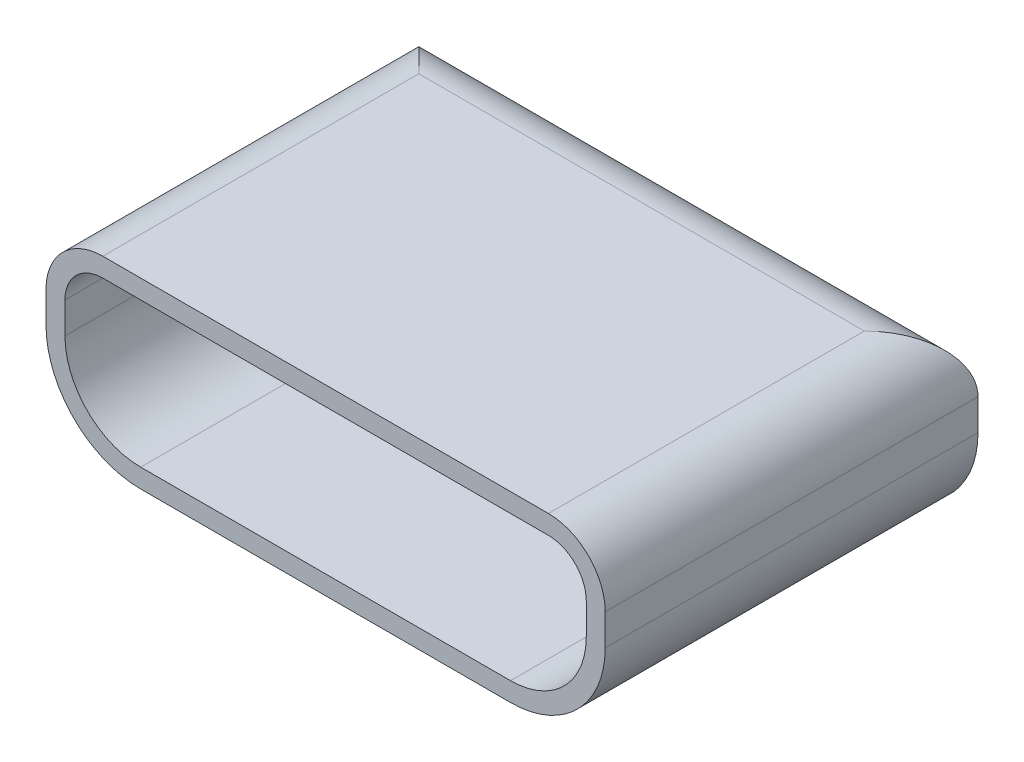
ISO-10303-21;
HEADER;
FILE_DESCRIPTION(('STEP AP214'),'2;1');
FILE_NAME('part.step','',(''),(''),'','','');
FILE_SCHEMA(('AUTOMOTIVE_DESIGN { 1 0 10303 214 1 1 1 1 }'));
ENDSEC;
DATA;
#1=APPLICATION_CONTEXT('core data for automotive mechanical design processes');
#2=APPLICATION_PROTOCOL_DEFINITION('international standard','automotive_design',2000,#1);
#3=PRODUCT_CONTEXT('',#1,'mechanical');
#4=PRODUCT('Part','Part','',(#3));
#5=PRODUCT_RELATED_PRODUCT_CATEGORY('part','',(#4));
#6=PRODUCT_DEFINITION_FORMATION('','',#4);
#7=PRODUCT_DEFINITION_CONTEXT('part definition',#1,'design');
#8=PRODUCT_DEFINITION('design','',#6,#7);
#9=PRODUCT_DEFINITION_SHAPE('','',#8);
#10=(LENGTH_UNIT() NAMED_UNIT(*) SI_UNIT(.MILLI.,.METRE.));
#11=(NAMED_UNIT(*) PLANE_ANGLE_UNIT() SI_UNIT($,.RADIAN.));
#12=(NAMED_UNIT(*) SI_UNIT($,.STERADIAN.) SOLID_ANGLE_UNIT());
#13=UNCERTAINTY_MEASURE_WITH_UNIT(LENGTH_MEASURE(1.E-05),#10,'distance_accuracy_value','');
#14=(GEOMETRIC_REPRESENTATION_CONTEXT(3) GLOBAL_UNCERTAINTY_ASSIGNED_CONTEXT((#13)) GLOBAL_UNIT_ASSIGNED_CONTEXT((#10,
#11,#12)) REPRESENTATION_CONTEXT('',''));
#15=CARTESIAN_POINT('',(0.,0.,0.));
#16=DIRECTION('',(0.,0.,1.));
#17=DIRECTION('',(1.,0.,0.));
#18=AXIS2_PLACEMENT_3D('',#15,#16,#17);
#19=CARTESIAN_POINT('',(-3.75,-1.225,5.));
#20=DIRECTION('',(1.,0.,0.));
#21=DIRECTION('',(0.,0.,-1.));
#22=AXIS2_PLACEMENT_3D('',#19,#20,#21);
#23=PLANE('',#22);
#24=DIRECTION('',(0.,-1.,0.));
#25=VECTOR('',#24,1.);
#26=CARTESIAN_POINT('',(-3.75,-1.225,0.));
#27=LINE('',#26,#25);
#28=CARTESIAN_POINT('',(-3.75,0.462999999999999,0.));
#29=VERTEX_POINT('',#28);
#30=CARTESIAN_POINT('',(-3.75,0.0449999999999995,0.));
#31=VERTEX_POINT('',#30);
#32=EDGE_CURVE('E230',#29,#31,#27,.T.);
#33=ORIENTED_EDGE('',*,*,#32,.T.);
#34=DIRECTION('',(0.,0.,-1.));
#35=VECTOR('',#34,1.);
#36=CARTESIAN_POINT('',(-3.75,0.0449999999999995,5.));
#37=LINE('',#36,#35);
#38=CARTESIAN_POINT('',(-3.75,0.0449999999999995,5.));
#39=VERTEX_POINT('',#38);
#40=EDGE_CURVE('E268',#31,#39,#37,.F.);
#41=ORIENTED_EDGE('',*,*,#40,.T.);
#42=DIRECTION('',(0.,-1.,0.));
#43=VECTOR('',#42,1.);
#44=CARTESIAN_POINT('',(-3.75,-1.225,5.));
#45=LINE('',#44,#43);
#46=CARTESIAN_POINT('',(-3.75,0.462999999999999,5.));
#47=VERTEX_POINT('',#46);
#48=EDGE_CURVE('E218',#47,#39,#45,.T.);
#49=ORIENTED_EDGE('',*,*,#48,.F.);
#50=DIRECTION('',(0.,0.,-1.));
#51=VECTOR('',#50,1.);
#52=CARTESIAN_POINT('',(-3.75,0.462999999999999,5.));
#53=LINE('',#52,#51);
#54=EDGE_CURVE('E229',#47,#29,#53,.T.);
#55=ORIENTED_EDGE('',*,*,#54,.T.);
#56=EDGE_LOOP('',(#33,#41,#49,#55));
#57=FACE_BOUND('',#56,.T.);
#58=ADVANCED_FACE('F33',(#57),#23,.F.);
#59=CARTESIAN_POINT('',(3.75,-1.225,5.));
#60=DIRECTION('',(0.,1.,0.));
#61=DIRECTION('',(-1.,0.,0.));
#62=AXIS2_PLACEMENT_3D('',#59,#60,#61);
#63=PLANE('',#62);
#64=DIRECTION('',(1.,0.,0.));
#65=VECTOR('',#64,1.);
#66=CARTESIAN_POINT('',(3.75,-1.225,5.));
#67=LINE('',#66,#65);
#68=CARTESIAN_POINT('',(-2.48,-1.225,5.));
#69=VERTEX_POINT('',#68);
#70=CARTESIAN_POINT('',(2.48,-1.225,5.));
#71=VERTEX_POINT('',#70);
#72=EDGE_CURVE('E221',#69,#71,#67,.T.);
#73=ORIENTED_EDGE('',*,*,#72,.F.);
#74=DIRECTION('',(0.,0.,-1.));
#75=VECTOR('',#74,1.);
#76=CARTESIAN_POINT('',(-2.48,-1.225,5.));
#77=LINE('',#76,#75);
#78=CARTESIAN_POINT('',(-2.48,-1.225,0.));
#79=VERTEX_POINT('',#78);
#80=EDGE_CURVE('E261',#69,#79,#77,.T.);
#81=ORIENTED_EDGE('',*,*,#80,.T.);
#82=DIRECTION('',(1.,0.,0.));
#83=VECTOR('',#82,1.);
#84=CARTESIAN_POINT('',(3.75,-1.225,0.));
#85=LINE('',#84,#83);
#86=CARTESIAN_POINT('',(2.48,-1.225,0.));
#87=VERTEX_POINT('',#86);
#88=EDGE_CURVE('E233',#79,#87,#85,.T.);
#89=ORIENTED_EDGE('',*,*,#88,.T.);
#90=DIRECTION('',(0.,0.,-1.));
#91=VECTOR('',#90,1.);
#92=CARTESIAN_POINT('',(2.48,-1.225,5.));
#93=LINE('',#92,#91);
#94=EDGE_CURVE('E256',#87,#71,#93,.F.);
#95=ORIENTED_EDGE('',*,*,#94,.T.);
#96=EDGE_LOOP('',(#73,#81,#89,#95));
#97=FACE_BOUND('',#96,.T.);
#98=ADVANCED_FACE('F278',(#97),#63,.F.);
#99=CARTESIAN_POINT('',(3.75,-1.225,5.));
#100=DIRECTION('',(-1.,0.,0.));
#101=DIRECTION('',(0.,0.,1.));
#102=AXIS2_PLACEMENT_3D('',#99,#100,#101);
#103=PLANE('',#102);
#104=DIRECTION('',(0.,1.,0.));
#105=VECTOR('',#104,1.);
#106=CARTESIAN_POINT('',(3.75,-1.225,5.));
#107=LINE('',#106,#105);
#108=CARTESIAN_POINT('',(3.75,0.0450000000000001,5.));
#109=VERTEX_POINT('',#108);
#110=CARTESIAN_POINT('',(3.75,0.463,5.));
#111=VERTEX_POINT('',#110);
#112=EDGE_CURVE('E224',#109,#111,#107,.T.);
#113=ORIENTED_EDGE('',*,*,#112,.F.);
#114=DIRECTION('',(0.,0.,-1.));
#115=VECTOR('',#114,1.);
#116=CARTESIAN_POINT('',(3.75,0.0450000000000001,5.));
#117=LINE('',#116,#115);
#118=CARTESIAN_POINT('',(3.75,0.0450000000000001,0.));
#119=VERTEX_POINT('',#118);
#120=EDGE_CURVE('E11',#109,#119,#117,.T.);
#121=ORIENTED_EDGE('',*,*,#120,.T.);
#122=DIRECTION('',(0.,1.,0.));
#123=VECTOR('',#122,1.);
#124=CARTESIAN_POINT('',(3.75,-1.225,0.));
#125=LINE('',#124,#123);
#126=CARTESIAN_POINT('',(3.75,0.463,0.));
#127=VERTEX_POINT('',#126);
#128=EDGE_CURVE('E222',#119,#127,#125,.T.);
#129=ORIENTED_EDGE('',*,*,#128,.T.);
#130=DIRECTION('',(0.,0.,-1.));
#131=VECTOR('',#130,1.);
#132=CARTESIAN_POINT('',(3.75,0.463,5.));
#133=LINE('',#132,#131);
#134=EDGE_CURVE('E253',#127,#111,#133,.F.);
#135=ORIENTED_EDGE('',*,*,#134,.T.);
#136=EDGE_LOOP('',(#113,#121,#129,#135));
#137=FACE_BOUND('',#136,.T.);
#138=ADVANCED_FACE('F304',(#137),#103,.F.);
#139=CARTESIAN_POINT('',(3.75,1.225,5.));
#140=DIRECTION('',(0.,-1.,0.));
#141=DIRECTION('',(1.,0.,0.));
#142=AXIS2_PLACEMENT_3D('',#139,#140,#141);
#143=PLANE('',#142);
#144=DIRECTION('',(-1.,0.,0.));
#145=VECTOR('',#144,1.);
#146=CARTESIAN_POINT('',(3.75,1.225,0.762));
#147=LINE('',#146,#145);
#148=CARTESIAN_POINT('',(2.988,1.225,0.762));
#149=VERTEX_POINT('',#148);
#150=CARTESIAN_POINT('',(-2.988,1.225,0.762));
#151=VERTEX_POINT('',#150);
#152=EDGE_CURVE('E242',#149,#151,#147,.T.);
#153=ORIENTED_EDGE('',*,*,#152,.T.);
#154=DIRECTION('',(0.,0.,-1.));
#155=VECTOR('',#154,1.);
#156=CARTESIAN_POINT('',(-2.988,1.225,5.));
#157=LINE('',#156,#155);
#158=CARTESIAN_POINT('',(-2.988,1.225,5.));
#159=VERTEX_POINT('',#158);
#160=EDGE_CURVE('E244',#151,#159,#157,.F.);
#161=ORIENTED_EDGE('',*,*,#160,.T.);
#162=DIRECTION('',(-1.,0.,0.));
#163=VECTOR('',#162,1.);
#164=CARTESIAN_POINT('',(3.75,1.225,5.));
#165=LINE('',#164,#163);
#166=CARTESIAN_POINT('',(2.988,1.225,5.));
#167=VERTEX_POINT('',#166);
#168=EDGE_CURVE('E226',#167,#159,#165,.T.);
#169=ORIENTED_EDGE('',*,*,#168,.F.);
#170=DIRECTION('',(0.,0.,-1.));
#171=VECTOR('',#170,1.);
#172=CARTESIAN_POINT('',(2.988,1.225,5.));
#173=LINE('',#172,#171);
#174=EDGE_CURVE('E240',#167,#149,#173,.T.);
#175=ORIENTED_EDGE('',*,*,#174,.T.);
#176=EDGE_LOOP('',(#153,#161,#169,#175));
#177=FACE_BOUND('',#176,.T.);
#178=ADVANCED_FACE('F334',(#177),#143,.F.);
#179=CARTESIAN_POINT('',(0.,0.,5.));
#180=DIRECTION('',(0.,0.,1.));
#181=DIRECTION('',(1.,0.,0.));
#182=AXIS2_PLACEMENT_3D('',#179,#180,#181);
#183=PLANE('',#182);
#184=CARTESIAN_POINT('',(2.988,0.463,5.));
#185=DIRECTION('',(0.,0.,1.));
#186=DIRECTION('',(1.,0.,0.));
#187=AXIS2_PLACEMENT_3D('',#184,#185,#186);
#188=CIRCLE('',#187,0.508);
#189=CARTESIAN_POINT('',(3.496,0.463,5.));
#190=VERTEX_POINT('',#189);
#191=CARTESIAN_POINT('',(2.988,0.971,5.));
#192=VERTEX_POINT('',#191);
#193=EDGE_CURVE('E48',#190,#192,#188,.T.);
#194=ORIENTED_EDGE('',*,*,#193,.F.);
#195=DIRECTION('',(0.,1.,0.));
#196=VECTOR('',#195,1.);
#197=CARTESIAN_POINT('',(3.496,0.0450000000000002,5.));
#198=LINE('',#197,#196);
#199=CARTESIAN_POINT('',(3.496,0.0450000000000002,5.));
#200=VERTEX_POINT('',#199);
#201=EDGE_CURVE('E168',#200,#190,#198,.T.);
#202=ORIENTED_EDGE('',*,*,#201,.F.);
#203=CARTESIAN_POINT('',(2.48,0.0450000000000001,5.));
#204=DIRECTION('',(0.,0.,1.));
#205=DIRECTION('',(1.,0.,0.));
#206=AXIS2_PLACEMENT_3D('',#203,#204,#205);
#207=CIRCLE('',#206,1.016);
#208=CARTESIAN_POINT('',(2.48,-0.971,5.));
#209=VERTEX_POINT('',#208);
#210=EDGE_CURVE('E171',#209,#200,#207,.T.);
#211=ORIENTED_EDGE('',*,*,#210,.F.);
#212=DIRECTION('',(1.,0.,0.));
#213=VECTOR('',#212,1.);
#214=CARTESIAN_POINT('',(-2.48,-0.971000000000001,5.));
#215=LINE('',#214,#213);
#216=CARTESIAN_POINT('',(-2.48,-0.971000000000001,5.));
#217=VERTEX_POINT('',#216);
#218=EDGE_CURVE('E199',#217,#209,#215,.T.);
#219=ORIENTED_EDGE('',*,*,#218,.F.);
#220=CARTESIAN_POINT('',(-2.48,0.0449999999999994,5.));
#221=DIRECTION('',(0.,0.,1.));
#222=DIRECTION('',(1.,0.,0.));
#223=AXIS2_PLACEMENT_3D('',#220,#221,#222);
#224=CIRCLE('',#223,1.016);
#225=CARTESIAN_POINT('',(-3.496,0.0449999999999996,5.));
#226=VERTEX_POINT('',#225);
#227=EDGE_CURVE('E196',#226,#217,#224,.T.);
#228=ORIENTED_EDGE('',*,*,#227,.F.);
#229=DIRECTION('',(0.,-1.,0.));
#230=VECTOR('',#229,1.);
#231=CARTESIAN_POINT('',(-3.496,0.462999999999999,5.));
#232=LINE('',#231,#230);
#233=CARTESIAN_POINT('',(-3.496,0.462999999999999,5.));
#234=VERTEX_POINT('',#233);
#235=EDGE_CURVE('E193',#234,#226,#232,.T.);
#236=ORIENTED_EDGE('',*,*,#235,.F.);
#237=CARTESIAN_POINT('',(-2.988,0.462999999999999,5.));
#238=DIRECTION('',(0.,0.,1.));
#239=DIRECTION('',(1.,0.,0.));
#240=AXIS2_PLACEMENT_3D('',#237,#238,#239);
#241=CIRCLE('',#240,0.508);
#242=CARTESIAN_POINT('',(-2.988,0.971,5.));
#243=VERTEX_POINT('',#242);
#244=EDGE_CURVE('E190',#243,#234,#241,.T.);
#245=ORIENTED_EDGE('',*,*,#244,.F.);
#246=DIRECTION('',(-1.,0.,0.));
#247=VECTOR('',#246,1.);
#248=CARTESIAN_POINT('',(2.988,0.971,5.));
#249=LINE('',#248,#247);
#250=EDGE_CURVE('E188',#192,#243,#249,.T.);
#251=ORIENTED_EDGE('',*,*,#250,.F.);
#252=EDGE_LOOP('',(#194,#202,#211,#219,#228,#236,#245,#251));
#253=FACE_BOUND('',#252,.T.);
#254=ORIENTED_EDGE('',*,*,#48,.T.);
#255=CARTESIAN_POINT('',(-2.48,0.0449999999999994,5.));
#256=DIRECTION('',(0.,0.,1.));
#257=DIRECTION('',(1.,0.,0.));
#258=AXIS2_PLACEMENT_3D('',#255,#256,#257);
#259=CIRCLE('',#258,1.27);
#260=EDGE_CURVE('E41',#39,#69,#259,.T.);
#261=ORIENTED_EDGE('',*,*,#260,.T.);
#262=ORIENTED_EDGE('',*,*,#72,.T.);
#263=CARTESIAN_POINT('',(2.48,0.0450000000000001,5.));
#264=DIRECTION('',(0.,0.,1.));
#265=DIRECTION('',(1.,0.,0.));
#266=AXIS2_PLACEMENT_3D('',#263,#264,#265);
#267=CIRCLE('',#266,1.27);
#268=EDGE_CURVE('E56',#71,#109,#267,.T.);
#269=ORIENTED_EDGE('',*,*,#268,.T.);
#270=ORIENTED_EDGE('',*,*,#112,.T.);
#271=CARTESIAN_POINT('',(2.988,0.463,5.));
#272=DIRECTION('',(0.,0.,1.));
#273=DIRECTION('',(1.,0.,0.));
#274=AXIS2_PLACEMENT_3D('',#271,#272,#273);
#275=CIRCLE('',#274,0.762);
#276=EDGE_CURVE('E246',#111,#167,#275,.T.);
#277=ORIENTED_EDGE('',*,*,#276,.T.);
#278=ORIENTED_EDGE('',*,*,#168,.T.);
#279=CARTESIAN_POINT('',(-2.988,0.462999999999999,5.));
#280=DIRECTION('',(0.,0.,1.));
#281=DIRECTION('',(1.,0.,0.));
#282=AXIS2_PLACEMENT_3D('',#279,#280,#281);
#283=CIRCLE('',#282,0.762);
#284=EDGE_CURVE('E248',#159,#47,#283,.T.);
#285=ORIENTED_EDGE('',*,*,#284,.T.);
#286=EDGE_LOOP('',(#254,#261,#262,#269,#270,#277,#278,#285));
#287=FACE_BOUND('',#286,.T.);
#288=ADVANCED_FACE('F272',(#253,#287),#183,.T.);
#289=CARTESIAN_POINT('',(0.,0.,0.));
#290=DIRECTION('',(0.,0.,1.));
#291=DIRECTION('',(1.,0.,0.));
#292=AXIS2_PLACEMENT_3D('',#289,#290,#291);
#293=PLANE('',#292);
#294=ORIENTED_EDGE('',*,*,#88,.F.);
#295=CARTESIAN_POINT('',(-2.48,0.0449999999999994,0.));
#296=DIRECTION('',(0.,0.,1.));
#297=DIRECTION('',(1.,0.,0.));
#298=AXIS2_PLACEMENT_3D('',#295,#296,#297);
#299=CIRCLE('',#298,1.27);
#300=EDGE_CURVE('E266',#79,#31,#299,.F.);
#301=ORIENTED_EDGE('',*,*,#300,.T.);
#302=ORIENTED_EDGE('',*,*,#32,.F.);
#303=DIRECTION('',(-1.,0.,0.));
#304=VECTOR('',#303,1.);
#305=CARTESIAN_POINT('',(0.,0.463,0.));
#306=LINE('',#305,#304);
#307=EDGE_CURVE('E250',#29,#127,#306,.F.);
#308=ORIENTED_EDGE('',*,*,#307,.T.);
#309=ORIENTED_EDGE('',*,*,#128,.F.);
#310=CARTESIAN_POINT('',(2.48,0.0450000000000001,0.));
#311=DIRECTION('',(0.,0.,1.));
#312=DIRECTION('',(1.,0.,0.));
#313=AXIS2_PLACEMENT_3D('',#310,#311,#312);
#314=CIRCLE('',#313,1.27);
#315=EDGE_CURVE('E264',#119,#87,#314,.F.);
#316=ORIENTED_EDGE('',*,*,#315,.T.);
#317=EDGE_LOOP('',(#294,#301,#302,#308,#309,#316));
#318=FACE_BOUND('',#317,.T.);
#319=ADVANCED_FACE('F284',(#318),#293,.F.);
#320=CARTESIAN_POINT('',(2.988,0.463,5.));
#321=DIRECTION('',(0.,0.,-1.));
#322=DIRECTION('',(-1.,0.,0.));
#323=AXIS2_PLACEMENT_3D('',#320,#321,#322);
#324=CYLINDRICAL_SURFACE('',#323,0.762);
#325=ORIENTED_EDGE('',*,*,#276,.F.);
#326=ORIENTED_EDGE('',*,*,#134,.F.);
#327=CARTESIAN_POINT('',(2.988,0.463,0.762));
#328=DIRECTION('',(-0.707106781186547,0.,-0.707106781186547));
#329=DIRECTION('',(0.707106781186547,0.,-0.707106781186547));
#330=AXIS2_PLACEMENT_3D('',#327,#328,#329);
#331=ELLIPSE('',#330,1.0776307345283,0.762);
#332=EDGE_CURVE('E234',#149,#127,#331,.T.);
#333=ORIENTED_EDGE('',*,*,#332,.F.);
#334=ORIENTED_EDGE('',*,*,#174,.F.);
#335=EDGE_LOOP('',(#325,#326,#333,#334));
#336=FACE_BOUND('',#335,.T.);
#337=ADVANCED_FACE('F301',(#336),#324,.T.);
#338=CARTESIAN_POINT('',(3.75,0.463,0.762));
#339=DIRECTION('',(-1.,0.,0.));
#340=DIRECTION('',(0.,-1.,0.));
#341=AXIS2_PLACEMENT_3D('',#338,#339,#340);
#342=CYLINDRICAL_SURFACE('',#341,0.762);
#343=ORIENTED_EDGE('',*,*,#332,.T.);
#344=ORIENTED_EDGE('',*,*,#307,.F.);
#345=CARTESIAN_POINT('',(-2.988,0.463,0.762));
#346=DIRECTION('',(-0.707106781186547,0.,0.707106781186547));
#347=DIRECTION('',(-0.707106781186547,0.,-0.707106781186547));
#348=AXIS2_PLACEMENT_3D('',#345,#346,#347);
#349=ELLIPSE('',#348,1.0776307345283,0.762);
#350=EDGE_CURVE('E206',#151,#29,#349,.T.);
#351=ORIENTED_EDGE('',*,*,#350,.F.);
#352=ORIENTED_EDGE('',*,*,#152,.F.);
#353=EDGE_LOOP('',(#343,#344,#351,#352));
#354=FACE_BOUND('',#353,.T.);
#355=ADVANCED_FACE('F295',(#354),#342,.T.);
#356=CARTESIAN_POINT('',(-2.988,0.462999999999999,5.));
#357=DIRECTION('',(0.,0.,-1.));
#358=DIRECTION('',(-1.,0.,0.));
#359=AXIS2_PLACEMENT_3D('',#356,#357,#358);
#360=CYLINDRICAL_SURFACE('',#359,0.762);
#361=ORIENTED_EDGE('',*,*,#284,.F.);
#362=ORIENTED_EDGE('',*,*,#160,.F.);
#363=ORIENTED_EDGE('',*,*,#350,.T.);
#364=ORIENTED_EDGE('',*,*,#54,.F.);
#365=EDGE_LOOP('',(#361,#362,#363,#364));
#366=FACE_BOUND('',#365,.T.);
#367=ADVANCED_FACE('F289',(#366),#360,.T.);
#368=CARTESIAN_POINT('',(-2.48,0.0449999999999994,5.));
#369=DIRECTION('',(0.,0.,-1.));
#370=DIRECTION('',(-1.,0.,0.));
#371=AXIS2_PLACEMENT_3D('',#368,#369,#370);
#372=CYLINDRICAL_SURFACE('',#371,1.27);
#373=ORIENTED_EDGE('',*,*,#260,.F.);
#374=ORIENTED_EDGE('',*,*,#40,.F.);
#375=ORIENTED_EDGE('',*,*,#300,.F.);
#376=ORIENTED_EDGE('',*,*,#80,.F.);
#377=EDGE_LOOP('',(#373,#374,#375,#376));
#378=FACE_BOUND('',#377,.T.);
#379=ADVANCED_FACE('F281',(#378),#372,.T.);
#380=CARTESIAN_POINT('',(2.48,0.0450000000000001,5.));
#381=DIRECTION('',(0.,0.,-1.));
#382=DIRECTION('',(-1.,0.,0.));
#383=AXIS2_PLACEMENT_3D('',#380,#381,#382);
#384=CYLINDRICAL_SURFACE('',#383,1.27);
#385=ORIENTED_EDGE('',*,*,#268,.F.);
#386=ORIENTED_EDGE('',*,*,#94,.F.);
#387=ORIENTED_EDGE('',*,*,#315,.F.);
#388=ORIENTED_EDGE('',*,*,#120,.F.);
#389=EDGE_LOOP('',(#385,#386,#387,#388));
#390=FACE_BOUND('',#389,.T.);
#391=ADVANCED_FACE('F35',(#390),#384,.T.);
#392=CARTESIAN_POINT('',(2.988,0.463,1.));
#393=DIRECTION('',(0.,0.,1.));
#394=DIRECTION('',(1.,0.,0.));
#395=AXIS2_PLACEMENT_3D('',#392,#393,#394);
#396=CYLINDRICAL_SURFACE('',#395,0.508);
#397=ORIENTED_EDGE('',*,*,#193,.T.);
#398=DIRECTION('',(0.,0.,1.));
#399=VECTOR('',#398,1.);
#400=CARTESIAN_POINT('',(2.988,0.971,1.));
#401=LINE('',#400,#399);
#402=CARTESIAN_POINT('',(2.988,0.971,1.));
#403=VERTEX_POINT('',#402);
#404=EDGE_CURVE('E145',#403,#192,#401,.T.);
#405=ORIENTED_EDGE('',*,*,#404,.F.);
#406=CARTESIAN_POINT('',(2.988,0.463,1.));
#407=DIRECTION('',(0.,0.,1.));
#408=DIRECTION('',(1.,0.,0.));
#409=AXIS2_PLACEMENT_3D('',#406,#407,#408);
#410=CIRCLE('',#409,0.508);
#411=CARTESIAN_POINT('',(3.496,0.463,1.));
#412=VERTEX_POINT('',#411);
#413=EDGE_CURVE('E149',#412,#403,#410,.T.);
#414=ORIENTED_EDGE('',*,*,#413,.F.);
#415=DIRECTION('',(0.,0.,1.));
#416=VECTOR('',#415,1.);
#417=CARTESIAN_POINT('',(3.496,0.463,1.));
#418=LINE('',#417,#416);
#419=EDGE_CURVE('E204',#412,#190,#418,.T.);
#420=ORIENTED_EDGE('',*,*,#419,.T.);
#421=EDGE_LOOP('',(#397,#405,#414,#420));
#422=FACE_BOUND('',#421,.T.);
#423=ADVANCED_FACE('F147',(#422),#396,.F.);
#424=CARTESIAN_POINT('',(3.496,0.0450000000000002,1.));
#425=DIRECTION('',(1.,0.,0.));
#426=DIRECTION('',(0.,0.,-1.));
#427=AXIS2_PLACEMENT_3D('',#424,#425,#426);
#428=PLANE('',#427);
#429=ORIENTED_EDGE('',*,*,#201,.T.);
#430=ORIENTED_EDGE('',*,*,#419,.F.);
#431=DIRECTION('',(0.,1.,0.));
#432=VECTOR('',#431,1.);
#433=CARTESIAN_POINT('',(3.496,0.0450000000000002,1.));
#434=LINE('',#433,#432);
#435=CARTESIAN_POINT('',(3.496,0.0450000000000002,1.));
#436=VERTEX_POINT('',#435);
#437=EDGE_CURVE('E155',#436,#412,#434,.T.);
#438=ORIENTED_EDGE('',*,*,#437,.F.);
#439=DIRECTION('',(0.,0.,1.));
#440=VECTOR('',#439,1.);
#441=CARTESIAN_POINT('',(3.496,0.0450000000000002,1.));
#442=LINE('',#441,#440);
#443=EDGE_CURVE('E207',#436,#200,#442,.T.);
#444=ORIENTED_EDGE('',*,*,#443,.T.);
#445=EDGE_LOOP('',(#429,#430,#438,#444));
#446=FACE_BOUND('',#445,.T.);
#447=ADVANCED_FACE('F312',(#446),#428,.F.);
#448=CARTESIAN_POINT('',(2.48,0.0450000000000001,1.));
#449=DIRECTION('',(0.,0.,1.));
#450=DIRECTION('',(1.,0.,0.));
#451=AXIS2_PLACEMENT_3D('',#448,#449,#450);
#452=CYLINDRICAL_SURFACE('',#451,1.016);
#453=ORIENTED_EDGE('',*,*,#210,.T.);
#454=ORIENTED_EDGE('',*,*,#443,.F.);
#455=CARTESIAN_POINT('',(2.48,0.0450000000000001,1.));
#456=DIRECTION('',(0.,0.,1.));
#457=DIRECTION('',(1.,0.,0.));
#458=AXIS2_PLACEMENT_3D('',#455,#456,#457);
#459=CIRCLE('',#458,1.016);
#460=CARTESIAN_POINT('',(2.48,-0.971,1.));
#461=VERTEX_POINT('',#460);
#462=EDGE_CURVE('E184',#461,#436,#459,.T.);
#463=ORIENTED_EDGE('',*,*,#462,.F.);
#464=DIRECTION('',(0.,0.,1.));
#465=VECTOR('',#464,1.);
#466=CARTESIAN_POINT('',(2.48,-0.971,1.));
#467=LINE('',#466,#465);
#468=EDGE_CURVE('E209',#461,#209,#467,.T.);
#469=ORIENTED_EDGE('',*,*,#468,.T.);
#470=EDGE_LOOP('',(#453,#454,#463,#469));
#471=FACE_BOUND('',#470,.T.);
#472=ADVANCED_FACE('F372',(#471),#452,.F.);
#473=CARTESIAN_POINT('',(-2.48,-0.971000000000001,1.));
#474=DIRECTION('',(0.,-1.,0.));
#475=DIRECTION('',(1.,0.,0.));
#476=AXIS2_PLACEMENT_3D('',#473,#474,#475);
#477=PLANE('',#476);
#478=ORIENTED_EDGE('',*,*,#218,.T.);
#479=ORIENTED_EDGE('',*,*,#468,.F.);
#480=DIRECTION('',(1.,0.,0.));
#481=VECTOR('',#480,1.);
#482=CARTESIAN_POINT('',(-2.48,-0.971000000000001,1.));
#483=LINE('',#482,#481);
#484=CARTESIAN_POINT('',(-2.48,-0.971000000000001,1.));
#485=VERTEX_POINT('',#484);
#486=EDGE_CURVE('E181',#485,#461,#483,.T.);
#487=ORIENTED_EDGE('',*,*,#486,.F.);
#488=DIRECTION('',(0.,0.,1.));
#489=VECTOR('',#488,1.);
#490=CARTESIAN_POINT('',(-2.48,-0.971000000000001,1.));
#491=LINE('',#490,#489);
#492=EDGE_CURVE('E211',#485,#217,#491,.T.);
#493=ORIENTED_EDGE('',*,*,#492,.T.);
#494=EDGE_LOOP('',(#478,#479,#487,#493));
#495=FACE_BOUND('',#494,.T.);
#496=ADVANCED_FACE('F382',(#495),#477,.F.);
#497=CARTESIAN_POINT('',(-2.48,0.0449999999999994,1.));
#498=DIRECTION('',(0.,0.,1.));
#499=DIRECTION('',(1.,0.,0.));
#500=AXIS2_PLACEMENT_3D('',#497,#498,#499);
#501=CYLINDRICAL_SURFACE('',#500,1.016);
#502=ORIENTED_EDGE('',*,*,#227,.T.);
#503=ORIENTED_EDGE('',*,*,#492,.F.);
#504=CARTESIAN_POINT('',(-2.48,0.0449999999999994,1.));
#505=DIRECTION('',(0.,0.,1.));
#506=DIRECTION('',(1.,0.,0.));
#507=AXIS2_PLACEMENT_3D('',#504,#505,#506);
#508=CIRCLE('',#507,1.016);
#509=CARTESIAN_POINT('',(-3.496,0.0449999999999996,1.));
#510=VERTEX_POINT('',#509);
#511=EDGE_CURVE('E178',#510,#485,#508,.T.);
#512=ORIENTED_EDGE('',*,*,#511,.F.);
#513=DIRECTION('',(0.,0.,1.));
#514=VECTOR('',#513,1.);
#515=CARTESIAN_POINT('',(-3.496,0.0449999999999996,1.));
#516=LINE('',#515,#514);
#517=EDGE_CURVE('E213',#510,#226,#516,.T.);
#518=ORIENTED_EDGE('',*,*,#517,.T.);
#519=EDGE_LOOP('',(#502,#503,#512,#518));
#520=FACE_BOUND('',#519,.T.);
#521=ADVANCED_FACE('F392',(#520),#501,.F.);
#522=CARTESIAN_POINT('',(-3.496,0.462999999999999,1.));
#523=DIRECTION('',(-1.,0.,0.));
#524=DIRECTION('',(0.,0.,1.));
#525=AXIS2_PLACEMENT_3D('',#522,#523,#524);
#526=PLANE('',#525);
#527=ORIENTED_EDGE('',*,*,#235,.T.);
#528=ORIENTED_EDGE('',*,*,#517,.F.);
#529=DIRECTION('',(0.,-1.,0.));
#530=VECTOR('',#529,1.);
#531=CARTESIAN_POINT('',(-3.496,0.462999999999999,1.));
#532=LINE('',#531,#530);
#533=CARTESIAN_POINT('',(-3.496,0.462999999999999,1.));
#534=VERTEX_POINT('',#533);
#535=EDGE_CURVE('E175',#534,#510,#532,.T.);
#536=ORIENTED_EDGE('',*,*,#535,.F.);
#537=DIRECTION('',(0.,0.,1.));
#538=VECTOR('',#537,1.);
#539=CARTESIAN_POINT('',(-3.496,0.462999999999999,1.));
#540=LINE('',#539,#538);
#541=EDGE_CURVE('E215',#534,#234,#540,.T.);
#542=ORIENTED_EDGE('',*,*,#541,.T.);
#543=EDGE_LOOP('',(#527,#528,#536,#542));
#544=FACE_BOUND('',#543,.T.);
#545=ADVANCED_FACE('F402',(#544),#526,.F.);
#546=CARTESIAN_POINT('',(-2.988,0.462999999999999,1.));
#547=DIRECTION('',(0.,0.,1.));
#548=DIRECTION('',(1.,0.,0.));
#549=AXIS2_PLACEMENT_3D('',#546,#547,#548);
#550=CYLINDRICAL_SURFACE('',#549,0.508);
#551=ORIENTED_EDGE('',*,*,#244,.T.);
#552=ORIENTED_EDGE('',*,*,#541,.F.);
#553=CARTESIAN_POINT('',(-2.988,0.462999999999999,1.));
#554=DIRECTION('',(0.,0.,1.));
#555=DIRECTION('',(1.,0.,0.));
#556=AXIS2_PLACEMENT_3D('',#553,#554,#555);
#557=CIRCLE('',#556,0.508);
#558=CARTESIAN_POINT('',(-2.988,0.971,1.));
#559=VERTEX_POINT('',#558);
#560=EDGE_CURVE('E163',#559,#534,#557,.T.);
#561=ORIENTED_EDGE('',*,*,#560,.F.);
#562=DIRECTION('',(0.,0.,1.));
#563=VECTOR('',#562,1.);
#564=CARTESIAN_POINT('',(-2.988,0.971,1.));
#565=LINE('',#564,#563);
#566=EDGE_CURVE('E154',#559,#243,#565,.T.);
#567=ORIENTED_EDGE('',*,*,#566,.T.);
#568=EDGE_LOOP('',(#551,#552,#561,#567));
#569=FACE_BOUND('',#568,.T.);
#570=ADVANCED_FACE('F412',(#569),#550,.F.);
#571=CARTESIAN_POINT('',(2.988,0.971,1.));
#572=DIRECTION('',(0.,1.,0.));
#573=DIRECTION('',(-1.,0.,0.));
#574=AXIS2_PLACEMENT_3D('',#571,#572,#573);
#575=PLANE('',#574);
#576=ORIENTED_EDGE('',*,*,#250,.T.);
#577=ORIENTED_EDGE('',*,*,#566,.F.);
#578=DIRECTION('',(-1.,0.,0.));
#579=VECTOR('',#578,1.);
#580=CARTESIAN_POINT('',(2.988,0.971,1.));
#581=LINE('',#580,#579);
#582=EDGE_CURVE('E158',#403,#559,#581,.T.);
#583=ORIENTED_EDGE('',*,*,#582,.F.);
#584=ORIENTED_EDGE('',*,*,#404,.T.);
#585=EDGE_LOOP('',(#576,#577,#583,#584));
#586=FACE_BOUND('',#585,.T.);
#587=ADVANCED_FACE('F159',(#586),#575,.F.);
#588=CARTESIAN_POINT('',(2.988,0.463,1.));
#589=DIRECTION('',(0.,0.,1.));
#590=DIRECTION('',(1.,0.,0.));
#591=AXIS2_PLACEMENT_3D('',#588,#589,#590);
#592=PLANE('',#591);
#593=ORIENTED_EDGE('',*,*,#413,.T.);
#594=ORIENTED_EDGE('',*,*,#582,.T.);
#595=ORIENTED_EDGE('',*,*,#560,.T.);
#596=ORIENTED_EDGE('',*,*,#535,.T.);
#597=ORIENTED_EDGE('',*,*,#511,.T.);
#598=ORIENTED_EDGE('',*,*,#486,.T.);
#599=ORIENTED_EDGE('',*,*,#462,.T.);
#600=ORIENTED_EDGE('',*,*,#437,.T.);
#601=EDGE_LOOP('',(#593,#594,#595,#596,#597,#598,#599,#600));
#602=FACE_BOUND('',#601,.T.);
#603=ADVANCED_FACE('F165',(#602),#592,.T.);
#604=CLOSED_SHELL('',(#58,#98,#138,#178,#288,#319,#337,#355,#367,#379,#391,#423,#447,#472,#496,
#521,#545,#570,#587,#603));
#605=MANIFOLD_SOLID_BREP('B2',#604);
#606=ADVANCED_BREP_SHAPE_REPRESENTATION('',(#18,#605),#14);
#607=SHAPE_DEFINITION_REPRESENTATION(#9,#606);
ENDSEC;
END-ISO-10303-21;
